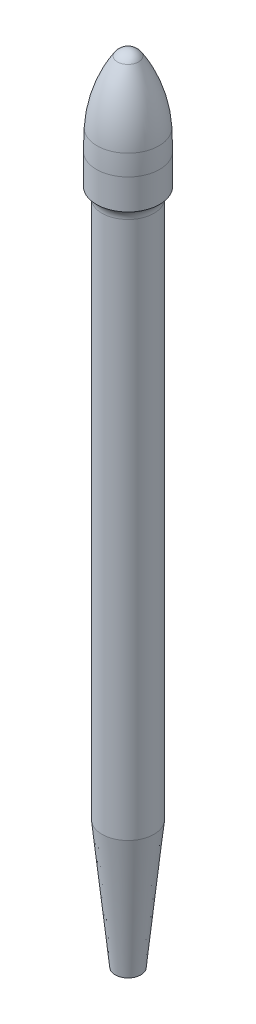
ISO-10303-21;
HEADER;
FILE_DESCRIPTION(('STEP AP214'),'2;1');
FILE_NAME('part.step','',(''),(''),'','','');
FILE_SCHEMA(('AUTOMOTIVE_DESIGN { 1 0 10303 214 1 1 1 1 }'));
ENDSEC;
DATA;
#1=APPLICATION_CONTEXT('core data for automotive mechanical design processes');
#2=APPLICATION_PROTOCOL_DEFINITION('international standard','automotive_design',2000,#1);
#3=PRODUCT_CONTEXT('',#1,'mechanical');
#4=PRODUCT('Part','Part','',(#3));
#5=PRODUCT_RELATED_PRODUCT_CATEGORY('part','',(#4));
#6=PRODUCT_DEFINITION_FORMATION('','',#4);
#7=PRODUCT_DEFINITION_CONTEXT('part definition',#1,'design');
#8=PRODUCT_DEFINITION('design','',#6,#7);
#9=PRODUCT_DEFINITION_SHAPE('','',#8);
#10=(LENGTH_UNIT() NAMED_UNIT(*) SI_UNIT(.MILLI.,.METRE.));
#11=(NAMED_UNIT(*) PLANE_ANGLE_UNIT() SI_UNIT($,.RADIAN.));
#12=(NAMED_UNIT(*) SI_UNIT($,.STERADIAN.) SOLID_ANGLE_UNIT());
#13=UNCERTAINTY_MEASURE_WITH_UNIT(LENGTH_MEASURE(1.E-05),#10,'distance_accuracy_value','');
#14=(GEOMETRIC_REPRESENTATION_CONTEXT(3) GLOBAL_UNCERTAINTY_ASSIGNED_CONTEXT((#13)) GLOBAL_UNIT_ASSIGNED_CONTEXT((#10,
#11,#12)) REPRESENTATION_CONTEXT('',''));
#15=CARTESIAN_POINT('',(0.,0.,0.));
#16=DIRECTION('',(0.,0.,1.));
#17=DIRECTION('',(1.,0.,0.));
#18=AXIS2_PLACEMENT_3D('',#15,#16,#17);
#19=CARTESIAN_POINT('',(-0.51,0.,0.));
#20=DIRECTION('',(0.,1.,0.));
#21=DIRECTION('',(0.,0.,1.));
#22=AXIS2_PLACEMENT_3D('',#19,#20,#21);
#23=PLANE('',#22);
#24=CARTESIAN_POINT('',(0.,0.,0.));
#25=DIRECTION('',(0.,-1.,0.));
#26=DIRECTION('',(0.,0.,-1.));
#27=AXIS2_PLACEMENT_3D('',#24,#25,#26);
#28=CIRCLE('',#27,0.51);
#29=CARTESIAN_POINT('',(0.,0.,-0.51));
#30=VERTEX_POINT('',#29);
#31=EDGE_CURVE('E10',#30,#30,#28,.T.);
#32=ORIENTED_EDGE('',*,*,#31,.T.);
#33=EDGE_LOOP('',(#32));
#34=FACE_BOUND('',#33,.T.);
#35=ADVANCED_FACE('F34',(#34),#23,.F.);
#36=CARTESIAN_POINT('',(0.,5.08,0.));
#37=DIRECTION('',(0.,1.,0.));
#38=DIRECTION('',(0.,0.,1.));
#39=AXIS2_PLACEMENT_3D('',#36,#37,#38);
#40=CONICAL_SURFACE('',#39,1.025,0.101032775195646);
#41=ORIENTED_EDGE('',*,*,#31,.F.);
#42=EDGE_LOOP('',(#41));
#43=FACE_BOUND('',#42,.T.);
#44=CARTESIAN_POINT('',(0.,5.08,0.));
#45=DIRECTION('',(0.,-1.,0.));
#46=DIRECTION('',(0.,0.,-1.));
#47=AXIS2_PLACEMENT_3D('',#44,#45,#46);
#48=CIRCLE('',#47,1.025);
#49=CARTESIAN_POINT('',(0.,5.08,-1.025));
#50=VERTEX_POINT('',#49);
#51=EDGE_CURVE('E41',#50,#50,#48,.T.);
#52=ORIENTED_EDGE('',*,*,#51,.T.);
#53=EDGE_LOOP('',(#52));
#54=FACE_BOUND('',#53,.T.);
#55=ADVANCED_FACE('F85',(#43,#54),#40,.T.);
#56=CARTESIAN_POINT('',(0.,0.,0.));
#57=DIRECTION('',(0.,-1.,0.));
#58=DIRECTION('',(0.,0.,-1.));
#59=AXIS2_PLACEMENT_3D('',#56,#57,#58);
#60=CYLINDRICAL_SURFACE('',#59,1.025);
#61=ORIENTED_EDGE('',*,*,#51,.F.);
#62=EDGE_LOOP('',(#61));
#63=FACE_BOUND('',#62,.T.);
#64=CARTESIAN_POINT('',(0.,26.3824176727877,0.));
#65=DIRECTION('',(0.,-1.,0.));
#66=DIRECTION('',(0.,0.,-1.));
#67=AXIS2_PLACEMENT_3D('',#64,#65,#66);
#68=CIRCLE('',#67,1.025);
#69=CARTESIAN_POINT('',(0.,26.3824176727877,-1.025));
#70=VERTEX_POINT('',#69);
#71=EDGE_CURVE('E47',#70,#70,#68,.T.);
#72=ORIENTED_EDGE('',*,*,#71,.T.);
#73=EDGE_LOOP('',(#72));
#74=FACE_BOUND('',#73,.T.);
#75=ADVANCED_FACE('F89',(#63,#74),#60,.T.);
#76=CARTESIAN_POINT('',(0.,26.3824176727877,0.));
#77=DIRECTION('',(0.,-1.,0.));
#78=DIRECTION('',(0.,0.,-1.));
#79=AXIS2_PLACEMENT_3D('',#76,#77,#78);
#80=TOROIDAL_SURFACE('',#79,1.525,0.499999999999999);
#81=ORIENTED_EDGE('',*,*,#71,.F.);
#82=EDGE_LOOP('',(#81));
#83=FACE_BOUND('',#82,.T.);
#84=CARTESIAN_POINT('',(0.,26.8,0.));
#85=DIRECTION('',(0.,-1.,0.));
#86=DIRECTION('',(0.,0.,-1.));
#87=AXIS2_PLACEMENT_3D('',#84,#85,#86);
#88=CIRCLE('',#87,1.25);
#89=CARTESIAN_POINT('',(0.,26.8,-1.25));
#90=VERTEX_POINT('',#89);
#91=EDGE_CURVE('E53',#90,#90,#88,.T.);
#92=ORIENTED_EDGE('',*,*,#91,.T.);
#93=EDGE_LOOP('',(#92));
#94=FACE_BOUND('',#93,.T.);
#95=ADVANCED_FACE('F94',(#83,#94),#80,.F.);
#96=CARTESIAN_POINT('',(0.,0.,0.));
#97=DIRECTION('',(0.,-1.,0.));
#98=DIRECTION('',(0.,0.,-1.));
#99=AXIS2_PLACEMENT_3D('',#96,#97,#98);
#100=CYLINDRICAL_SURFACE('',#99,1.25);
#101=ORIENTED_EDGE('',*,*,#91,.F.);
#102=EDGE_LOOP('',(#101));
#103=FACE_BOUND('',#102,.T.);
#104=CARTESIAN_POINT('',(0.,28.,0.));
#105=DIRECTION('',(0.,-1.,0.));
#106=DIRECTION('',(0.,0.,-1.));
#107=AXIS2_PLACEMENT_3D('',#104,#105,#106);
#108=CIRCLE('',#107,1.25);
#109=CARTESIAN_POINT('',(0.,28.,-1.25));
#110=VERTEX_POINT('',#109);
#111=EDGE_CURVE('E59',#110,#110,#108,.T.);
#112=ORIENTED_EDGE('',*,*,#111,.T.);
#113=EDGE_LOOP('',(#112));
#114=FACE_BOUND('',#113,.T.);
#115=ADVANCED_FACE('F100',(#103,#114),#100,.T.);
#116=CARTESIAN_POINT('',(0.,28.,0.));
#117=DIRECTION('',(0.,-1.,0.));
#118=DIRECTION('',(0.,0.,-1.));
#119=AXIS2_PLACEMENT_3D('',#116,#117,#118);
#120=DEGENERATE_TOROIDAL_SURFACE('',#119,13.75,15.,.F.);
#121=ORIENTED_EDGE('',*,*,#111,.F.);
#122=EDGE_LOOP('',(#121));
#123=FACE_BOUND('',#122,.T.);
#124=CARTESIAN_POINT('',(0.,28.8012879409434,0.));
#125=DIRECTION('',(0.,-1.,0.));
#126=DIRECTION('',(0.,0.,-1.));
#127=AXIS2_PLACEMENT_3D('',#124,#125,#126);
#128=CIRCLE('',#127,1.22858263106689);
#129=CARTESIAN_POINT('',(0.,28.8012879409434,-1.22858263106689));
#130=VERTEX_POINT('',#129);
#131=EDGE_CURVE('E63',#130,#130,#128,.T.);
#132=ORIENTED_EDGE('',*,*,#131,.T.);
#133=EDGE_LOOP('',(#132));
#134=FACE_BOUND('',#133,.T.);
#135=ADVANCED_FACE('F81',(#123,#134),#120,.F.);
#136=CARTESIAN_POINT('',(0.,28.534191960629,0.));
#137=DIRECTION('',(0.,-1.,0.));
#138=DIRECTION('',(0.,0.,-1.));
#139=AXIS2_PLACEMENT_3D('',#136,#137,#138);
#140=DEGENERATE_TOROIDAL_SURFACE('',#139,3.76427824595541,5.,.F.);
#141=ORIENTED_EDGE('',*,*,#131,.F.);
#142=EDGE_LOOP('',(#141));
#143=FACE_BOUND('',#142,.T.);
#144=CARTESIAN_POINT('',(0.,31.2739786710412,0.));
#145=DIRECTION('',(0.,-1.,0.));
#146=DIRECTION('',(0.,0.,-1.));
#147=AXIS2_PLACEMENT_3D('',#144,#145,#146);
#148=CIRCLE('',#147,0.418253138439487);
#149=CARTESIAN_POINT('',(0.,31.2739786710412,-0.418253138439487));
#150=VERTEX_POINT('',#149);
#151=EDGE_CURVE('E67',#150,#150,#148,.T.);
#152=ORIENTED_EDGE('',*,*,#151,.T.);
#153=EDGE_LOOP('',(#152));
#154=FACE_BOUND('',#153,.T.);
#155=ADVANCED_FACE('F73',(#143,#154),#140,.F.);
#156=CARTESIAN_POINT('',(0.,31.,0.));
#157=DIRECTION('',(0.,-1.,0.));
#158=DIRECTION('',(-1.,0.,0.));
#159=AXIS2_PLACEMENT_3D('',#156,#157,#158);
#160=SPHERICAL_SURFACE('',#159,0.5);
#161=ORIENTED_EDGE('',*,*,#151,.F.);
#162=EDGE_LOOP('',(#161));
#163=FACE_BOUND('',#162,.T.);
#164=ADVANCED_FACE('F75',(#163),#160,.T.);
#165=CLOSED_SHELL('',(#35,#55,#75,#95,#115,#135,#155,#164));
#166=MANIFOLD_SOLID_BREP('B2',#165);
#167=ADVANCED_BREP_SHAPE_REPRESENTATION('',(#18,#166),#14);
#168=SHAPE_DEFINITION_REPRESENTATION(#9,#167);
ENDSEC;
END-ISO-10303-21;
